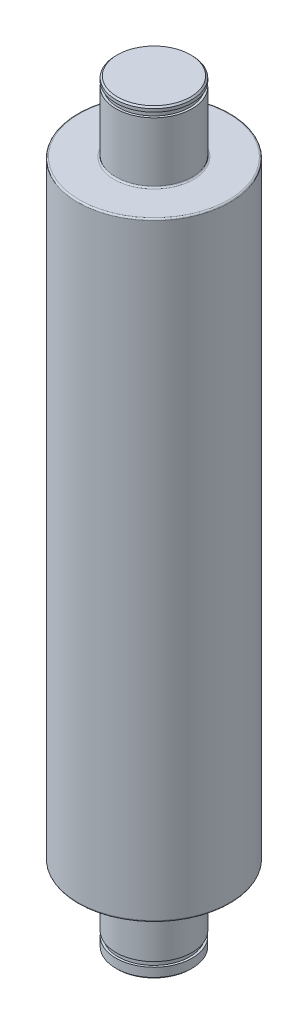
ISO-10303-21;
HEADER;
FILE_DESCRIPTION(('STEP AP214'),'2;1');
FILE_NAME('part.step','',(''),(''),'','','');
FILE_SCHEMA(('AUTOMOTIVE_DESIGN { 1 0 10303 214 1 1 1 1 }'));
ENDSEC;
DATA;
#1=APPLICATION_CONTEXT('core data for automotive mechanical design processes');
#2=APPLICATION_PROTOCOL_DEFINITION('international standard','automotive_design',2000,#1);
#3=PRODUCT_CONTEXT('',#1,'mechanical');
#4=PRODUCT('Part','Part','',(#3));
#5=PRODUCT_RELATED_PRODUCT_CATEGORY('part','',(#4));
#6=PRODUCT_DEFINITION_FORMATION('','',#4);
#7=PRODUCT_DEFINITION_CONTEXT('part definition',#1,'design');
#8=PRODUCT_DEFINITION('design','',#6,#7);
#9=PRODUCT_DEFINITION_SHAPE('','',#8);
#10=(LENGTH_UNIT() NAMED_UNIT(*) SI_UNIT(.MILLI.,.METRE.));
#11=(NAMED_UNIT(*) PLANE_ANGLE_UNIT() SI_UNIT($,.RADIAN.));
#12=(NAMED_UNIT(*) SI_UNIT($,.STERADIAN.) SOLID_ANGLE_UNIT());
#13=UNCERTAINTY_MEASURE_WITH_UNIT(LENGTH_MEASURE(1.E-05),#10,'distance_accuracy_value','');
#14=(GEOMETRIC_REPRESENTATION_CONTEXT(3) GLOBAL_UNCERTAINTY_ASSIGNED_CONTEXT((#13)) GLOBAL_UNIT_ASSIGNED_CONTEXT((#10,
#11,#12)) REPRESENTATION_CONTEXT('',''));
#15=CARTESIAN_POINT('',(0.,0.,0.));
#16=DIRECTION('',(0.,0.,1.));
#17=DIRECTION('',(1.,0.,0.));
#18=AXIS2_PLACEMENT_3D('',#15,#16,#17);
#19=CARTESIAN_POINT('',(0.,446.,0.));
#20=DIRECTION('',(0.,-1.,0.));
#21=DIRECTION('',(0.,0.,-1.));
#22=AXIS2_PLACEMENT_3D('',#19,#20,#21);
#23=CYLINDRICAL_SURFACE('',#22,25.);
#24=CARTESIAN_POINT('',(0.,401.,0.));
#25=DIRECTION('',(0.,1.,0.));
#26=DIRECTION('',(0.,0.,1.));
#27=AXIS2_PLACEMENT_3D('',#24,#25,#26);
#28=CIRCLE('',#27,25.);
#29=CARTESIAN_POINT('',(0.,401.,25.));
#30=VERTEX_POINT('',#29);
#31=EDGE_CURVE('E176',#30,#30,#28,.T.);
#32=ORIENTED_EDGE('',*,*,#31,.T.);
#33=EDGE_LOOP('',(#32));
#34=FACE_BOUND('',#33,.T.);
#35=CARTESIAN_POINT('',(0.,439.8,0.));
#36=DIRECTION('',(0.,1.,0.));
#37=DIRECTION('',(0.,0.,1.));
#38=AXIS2_PLACEMENT_3D('',#35,#36,#37);
#39=CIRCLE('',#38,25.);
#40=CARTESIAN_POINT('',(0.,439.8,25.));
#41=VERTEX_POINT('',#40);
#42=EDGE_CURVE('E141',#41,#41,#39,.T.);
#43=ORIENTED_EDGE('',*,*,#42,.F.);
#44=EDGE_LOOP('',(#43));
#45=FACE_BOUND('',#44,.T.);
#46=ADVANCED_FACE('F40',(#34,#45),#23,.T.);
#47=CARTESIAN_POINT('',(0.,0.,0.));
#48=DIRECTION('',(0.,1.,0.));
#49=DIRECTION('',(0.,0.,1.));
#50=AXIS2_PLACEMENT_3D('',#47,#48,#49);
#51=PLANE('',#50);
#52=CARTESIAN_POINT('',(0.,0.,0.));
#53=DIRECTION('',(0.,1.,0.));
#54=DIRECTION('',(0.,0.,1.));
#55=AXIS2_PLACEMENT_3D('',#52,#53,#54);
#56=CIRCLE('',#55,26.);
#57=CARTESIAN_POINT('',(0.,0.,26.));
#58=VERTEX_POINT('',#57);
#59=EDGE_CURVE('E156',#58,#58,#56,.T.);
#60=ORIENTED_EDGE('',*,*,#59,.T.);
#61=EDGE_LOOP('',(#60));
#62=FACE_BOUND('',#61,.T.);
#63=CARTESIAN_POINT('',(0.,0.,0.));
#64=DIRECTION('',(0.,1.,0.));
#65=DIRECTION('',(0.,0.,1.));
#66=AXIS2_PLACEMENT_3D('',#63,#64,#65);
#67=CIRCLE('',#66,49.);
#68=CARTESIAN_POINT('',(0.,0.,49.));
#69=VERTEX_POINT('',#68);
#70=EDGE_CURVE('E152',#69,#69,#67,.F.);
#71=ORIENTED_EDGE('',*,*,#70,.T.);
#72=EDGE_LOOP('',(#71));
#73=FACE_BOUND('',#72,.T.);
#74=ADVANCED_FACE('F225',(#62,#73),#51,.F.);
#75=CARTESIAN_POINT('',(0.,400.,0.));
#76=DIRECTION('',(0.,1.,0.));
#77=DIRECTION('',(0.,0.,1.));
#78=AXIS2_PLACEMENT_3D('',#75,#76,#77);
#79=PLANE('',#78);
#80=CARTESIAN_POINT('',(0.,400.,0.));
#81=DIRECTION('',(0.,1.,0.));
#82=DIRECTION('',(0.,0.,1.));
#83=AXIS2_PLACEMENT_3D('',#80,#81,#82);
#84=CIRCLE('',#83,49.);
#85=CARTESIAN_POINT('',(0.,400.,49.));
#86=VERTEX_POINT('',#85);
#87=EDGE_CURVE('E172',#86,#86,#84,.T.);
#88=ORIENTED_EDGE('',*,*,#87,.T.);
#89=EDGE_LOOP('',(#88));
#90=FACE_BOUND('',#89,.T.);
#91=CARTESIAN_POINT('',(0.,400.,0.));
#92=DIRECTION('',(0.,1.,0.));
#93=DIRECTION('',(0.,0.,1.));
#94=AXIS2_PLACEMENT_3D('',#91,#92,#93);
#95=CIRCLE('',#94,26.);
#96=CARTESIAN_POINT('',(0.,400.,26.));
#97=VERTEX_POINT('',#96);
#98=EDGE_CURVE('E168',#97,#97,#95,.F.);
#99=ORIENTED_EDGE('',*,*,#98,.T.);
#100=EDGE_LOOP('',(#99));
#101=FACE_BOUND('',#100,.T.);
#102=ADVANCED_FACE('F232',(#90,#101),#79,.T.);
#103=CARTESIAN_POINT('',(0.,400.,0.));
#104=DIRECTION('',(0.,-1.,0.));
#105=DIRECTION('',(0.,0.,-1.));
#106=AXIS2_PLACEMENT_3D('',#103,#104,#105);
#107=CYLINDRICAL_SURFACE('',#106,50.);
#108=CARTESIAN_POINT('',(0.,1.,0.));
#109=DIRECTION('',(0.,1.,0.));
#110=DIRECTION('',(0.,0.,1.));
#111=AXIS2_PLACEMENT_3D('',#108,#109,#110);
#112=CIRCLE('',#111,50.);
#113=CARTESIAN_POINT('',(0.,1.,50.));
#114=VERTEX_POINT('',#113);
#115=EDGE_CURVE('E164',#114,#114,#112,.T.);
#116=ORIENTED_EDGE('',*,*,#115,.T.);
#117=EDGE_LOOP('',(#116));
#118=FACE_BOUND('',#117,.T.);
#119=CARTESIAN_POINT('',(0.,399.,0.));
#120=DIRECTION('',(0.,1.,0.));
#121=DIRECTION('',(0.,0.,1.));
#122=AXIS2_PLACEMENT_3D('',#119,#120,#121);
#123=CIRCLE('',#122,50.);
#124=CARTESIAN_POINT('',(0.,399.,50.));
#125=VERTEX_POINT('',#124);
#126=EDGE_CURVE('E160',#125,#125,#123,.F.);
#127=ORIENTED_EDGE('',*,*,#126,.T.);
#128=EDGE_LOOP('',(#127));
#129=FACE_BOUND('',#128,.T.);
#130=ADVANCED_FACE('F277',(#118,#129),#107,.T.);
#131=CARTESIAN_POINT('',(0.,-50.,0.));
#132=DIRECTION('',(0.,1.,0.));
#133=DIRECTION('',(0.,0.,1.));
#134=AXIS2_PLACEMENT_3D('',#131,#132,#133);
#135=CYLINDRICAL_SURFACE('',#134,25.);
#136=CARTESIAN_POINT('',(0.,-40.,0.));
#137=DIRECTION('',(0.,1.,0.));
#138=DIRECTION('',(0.,0.,1.));
#139=AXIS2_PLACEMENT_3D('',#136,#137,#138);
#140=CIRCLE('',#139,25.);
#141=CARTESIAN_POINT('',(0.,-40.,25.));
#142=VERTEX_POINT('',#141);
#143=EDGE_CURVE('E130',#142,#142,#140,.T.);
#144=ORIENTED_EDGE('',*,*,#143,.T.);
#145=EDGE_LOOP('',(#144));
#146=FACE_BOUND('',#145,.T.);
#147=CARTESIAN_POINT('',(0.,-1.,0.));
#148=DIRECTION('',(0.,1.,0.));
#149=DIRECTION('',(0.,0.,1.));
#150=AXIS2_PLACEMENT_3D('',#147,#148,#149);
#151=CIRCLE('',#150,25.);
#152=CARTESIAN_POINT('',(0.,-1.,25.));
#153=VERTEX_POINT('',#152);
#154=EDGE_CURVE('E145',#153,#153,#151,.F.);
#155=ORIENTED_EDGE('',*,*,#154,.T.);
#156=EDGE_LOOP('',(#155));
#157=FACE_BOUND('',#156,.T.);
#158=ADVANCED_FACE('F274',(#146,#157),#135,.T.);
#159=CARTESIAN_POINT('',(0.,-1.,0.));
#160=DIRECTION('',(0.,1.,0.));
#161=DIRECTION('',(0.,0.,1.));
#162=AXIS2_PLACEMENT_3D('',#159,#160,#161);
#163=TOROIDAL_SURFACE('',#162,26.,1.);
#164=ORIENTED_EDGE('',*,*,#59,.F.);
#165=EDGE_LOOP('',(#164));
#166=FACE_BOUND('',#165,.T.);
#167=ORIENTED_EDGE('',*,*,#154,.F.);
#168=EDGE_LOOP('',(#167));
#169=FACE_BOUND('',#168,.T.);
#170=ADVANCED_FACE('F276',(#166,#169),#163,.F.);
#171=CARTESIAN_POINT('',(0.,1.,0.));
#172=DIRECTION('',(0.,1.,0.));
#173=DIRECTION('',(0.,0.,1.));
#174=AXIS2_PLACEMENT_3D('',#171,#172,#173);
#175=TOROIDAL_SURFACE('',#174,49.,1.);
#176=ORIENTED_EDGE('',*,*,#70,.F.);
#177=EDGE_LOOP('',(#176));
#178=FACE_BOUND('',#177,.T.);
#179=ORIENTED_EDGE('',*,*,#115,.F.);
#180=EDGE_LOOP('',(#179));
#181=FACE_BOUND('',#180,.T.);
#182=ADVANCED_FACE('F283',(#178,#181),#175,.T.);
#183=CARTESIAN_POINT('',(0.,399.,0.));
#184=DIRECTION('',(0.,1.,0.));
#185=DIRECTION('',(0.,0.,1.));
#186=AXIS2_PLACEMENT_3D('',#183,#184,#185);
#187=TOROIDAL_SURFACE('',#186,49.,1.);
#188=ORIENTED_EDGE('',*,*,#126,.F.);
#189=EDGE_LOOP('',(#188));
#190=FACE_BOUND('',#189,.T.);
#191=ORIENTED_EDGE('',*,*,#87,.F.);
#192=EDGE_LOOP('',(#191));
#193=FACE_BOUND('',#192,.T.);
#194=ADVANCED_FACE('F309',(#190,#193),#187,.T.);
#195=CARTESIAN_POINT('',(0.,401.,0.));
#196=DIRECTION('',(0.,1.,0.));
#197=DIRECTION('',(0.,0.,1.));
#198=AXIS2_PLACEMENT_3D('',#195,#196,#197);
#199=TOROIDAL_SURFACE('',#198,26.,1.);
#200=ORIENTED_EDGE('',*,*,#98,.F.);
#201=EDGE_LOOP('',(#200));
#202=FACE_BOUND('',#201,.T.);
#203=ORIENTED_EDGE('',*,*,#31,.F.);
#204=EDGE_LOOP('',(#203));
#205=FACE_BOUND('',#204,.T.);
#206=ADVANCED_FACE('F266',(#202,#205),#199,.F.);
#207=CARTESIAN_POINT('',(0.,439.8,0.));
#208=DIRECTION('',(0.,1.,0.));
#209=DIRECTION('',(0.,0.,1.));
#210=AXIS2_PLACEMENT_3D('',#207,#208,#209);
#211=PLANE('',#210);
#212=CARTESIAN_POINT('',(0.,439.8,0.));
#213=DIRECTION('',(0.,1.,0.));
#214=DIRECTION('',(0.,0.,1.));
#215=AXIS2_PLACEMENT_3D('',#212,#213,#214);
#216=CIRCLE('',#215,23.5);
#217=CARTESIAN_POINT('',(0.,439.8,23.5));
#218=VERTEX_POINT('',#217);
#219=EDGE_CURVE('E131',#218,#218,#216,.T.);
#220=ORIENTED_EDGE('',*,*,#219,.F.);
#221=EDGE_LOOP('',(#220));
#222=FACE_BOUND('',#221,.T.);
#223=ORIENTED_EDGE('',*,*,#42,.T.);
#224=EDGE_LOOP('',(#223));
#225=FACE_BOUND('',#224,.T.);
#226=ADVANCED_FACE('F257',(#222,#225),#211,.T.);
#227=CARTESIAN_POINT('',(0.,443.,0.));
#228=DIRECTION('',(0.,1.,0.));
#229=DIRECTION('',(0.,0.,1.));
#230=AXIS2_PLACEMENT_3D('',#227,#228,#229);
#231=PLANE('',#230);
#232=CARTESIAN_POINT('',(0.,443.,0.));
#233=DIRECTION('',(0.,1.,0.));
#234=DIRECTION('',(0.,0.,1.));
#235=AXIS2_PLACEMENT_3D('',#232,#233,#234);
#236=CIRCLE('',#235,23.5);
#237=CARTESIAN_POINT('',(0.,443.,23.5));
#238=VERTEX_POINT('',#237);
#239=EDGE_CURVE('E136',#238,#238,#236,.T.);
#240=ORIENTED_EDGE('',*,*,#239,.T.);
#241=EDGE_LOOP('',(#240));
#242=FACE_BOUND('',#241,.T.);
#243=CARTESIAN_POINT('',(0.,443.,0.));
#244=DIRECTION('',(0.,1.,0.));
#245=DIRECTION('',(0.,0.,1.));
#246=AXIS2_PLACEMENT_3D('',#243,#244,#245);
#247=CIRCLE('',#246,25.);
#248=CARTESIAN_POINT('',(0.,443.,25.));
#249=VERTEX_POINT('',#248);
#250=EDGE_CURVE('E135',#249,#249,#247,.T.);
#251=ORIENTED_EDGE('',*,*,#250,.F.);
#252=EDGE_LOOP('',(#251));
#253=FACE_BOUND('',#252,.T.);
#254=ADVANCED_FACE('F255',(#242,#253),#231,.F.);
#255=CARTESIAN_POINT('',(0.,439.8,0.));
#256=DIRECTION('',(0.,1.,0.));
#257=DIRECTION('',(0.,0.,1.));
#258=AXIS2_PLACEMENT_3D('',#255,#256,#257);
#259=CYLINDRICAL_SURFACE('',#258,23.5);
#260=ORIENTED_EDGE('',*,*,#219,.T.);
#261=EDGE_LOOP('',(#260));
#262=FACE_BOUND('',#261,.T.);
#263=ORIENTED_EDGE('',*,*,#239,.F.);
#264=EDGE_LOOP('',(#263));
#265=FACE_BOUND('',#264,.T.);
#266=ADVANCED_FACE('F249',(#262,#265),#259,.T.);
#267=CARTESIAN_POINT('',(0.,446.,0.));
#268=DIRECTION('',(0.,1.,0.));
#269=DIRECTION('',(0.,0.,1.));
#270=AXIS2_PLACEMENT_3D('',#267,#268,#269);
#271=PLANE('',#270);
#272=CARTESIAN_POINT('',(0.,446.,0.));
#273=DIRECTION('',(0.,1.,0.));
#274=DIRECTION('',(0.,0.,1.));
#275=AXIS2_PLACEMENT_3D('',#272,#273,#274);
#276=CIRCLE('',#275,23.9999999999999);
#277=CARTESIAN_POINT('',(0.,446.,23.9999999999999));
#278=VERTEX_POINT('',#277);
#279=EDGE_CURVE('E194',#278,#278,#276,.T.);
#280=ORIENTED_EDGE('',*,*,#279,.T.);
#281=EDGE_LOOP('',(#280));
#282=FACE_BOUND('',#281,.T.);
#283=ADVANCED_FACE('F240',(#282),#271,.T.);
#284=CARTESIAN_POINT('',(0.,445.,0.));
#285=DIRECTION('',(0.,1.,0.));
#286=DIRECTION('',(0.,0.,1.));
#287=AXIS2_PLACEMENT_3D('',#284,#285,#286);
#288=CIRCLE('',#287,25.);
#289=CARTESIAN_POINT('',(0.,445.,25.));
#290=VERTEX_POINT('',#289);
#291=EDGE_CURVE('E198',#290,#290,#288,.F.);
#292=ORIENTED_EDGE('',*,*,#291,.T.);
#293=EDGE_LOOP('',(#292));
#294=FACE_BOUND('',#293,.T.);
#295=ORIENTED_EDGE('',*,*,#250,.T.);
#296=EDGE_LOOP('',(#295));
#297=FACE_BOUND('',#296,.T.);
#298=ADVANCED_FACE('F228',(#294,#297),#23,.T.);
#299=CARTESIAN_POINT('',(28.7495233925461,-43.2,0.));
#300=DIRECTION('',(0.,-1.,0.));
#301=DIRECTION('',(0.,0.,-1.));
#302=AXIS2_PLACEMENT_3D('',#299,#300,#301);
#303=PLANE('',#302);
#304=CARTESIAN_POINT('',(0.,-43.2,0.));
#305=DIRECTION('',(0.,-1.,0.));
#306=DIRECTION('',(0.,0.,-1.));
#307=AXIS2_PLACEMENT_3D('',#304,#305,#306);
#308=CIRCLE('',#307,23.5);
#309=CARTESIAN_POINT('',(0.,-43.2,-23.5));
#310=VERTEX_POINT('',#309);
#311=EDGE_CURVE('E126',#310,#310,#308,.T.);
#312=ORIENTED_EDGE('',*,*,#311,.T.);
#313=EDGE_LOOP('',(#312));
#314=FACE_BOUND('',#313,.T.);
#315=CARTESIAN_POINT('',(0.,-43.2,0.));
#316=DIRECTION('',(0.,-1.,0.));
#317=DIRECTION('',(0.,0.,-1.));
#318=AXIS2_PLACEMENT_3D('',#315,#316,#317);
#319=CIRCLE('',#318,25.);
#320=CARTESIAN_POINT('',(0.,-43.2,-25.));
#321=VERTEX_POINT('',#320);
#322=EDGE_CURVE('E140',#321,#321,#319,.T.);
#323=ORIENTED_EDGE('',*,*,#322,.F.);
#324=EDGE_LOOP('',(#323));
#325=FACE_BOUND('',#324,.T.);
#326=ADVANCED_FACE('F239',(#314,#325),#303,.F.);
#327=CARTESIAN_POINT('',(28.7495233925461,-40.,0.));
#328=DIRECTION('',(0.,1.,0.));
#329=DIRECTION('',(0.,0.,1.));
#330=AXIS2_PLACEMENT_3D('',#327,#328,#329);
#331=PLANE('',#330);
#332=CARTESIAN_POINT('',(0.,-40.,0.));
#333=DIRECTION('',(0.,-1.,0.));
#334=DIRECTION('',(0.,0.,-1.));
#335=AXIS2_PLACEMENT_3D('',#332,#333,#334);
#336=CIRCLE('',#335,23.5);
#337=CARTESIAN_POINT('',(0.,-40.,-23.5));
#338=VERTEX_POINT('',#337);
#339=EDGE_CURVE('E119',#338,#338,#336,.T.);
#340=ORIENTED_EDGE('',*,*,#339,.F.);
#341=EDGE_LOOP('',(#340));
#342=FACE_BOUND('',#341,.T.);
#343=ORIENTED_EDGE('',*,*,#143,.F.);
#344=EDGE_LOOP('',(#343));
#345=FACE_BOUND('',#344,.T.);
#346=ADVANCED_FACE('F246',(#342,#345),#331,.F.);
#347=CARTESIAN_POINT('',(0.,-50.,0.));
#348=DIRECTION('',(0.,-1.,0.));
#349=DIRECTION('',(0.,0.,-1.));
#350=AXIS2_PLACEMENT_3D('',#347,#348,#349);
#351=CYLINDRICAL_SURFACE('',#350,23.5);
#352=ORIENTED_EDGE('',*,*,#311,.F.);
#353=EDGE_LOOP('',(#352));
#354=FACE_BOUND('',#353,.T.);
#355=ORIENTED_EDGE('',*,*,#339,.T.);
#356=EDGE_LOOP('',(#355));
#357=FACE_BOUND('',#356,.T.);
#358=ADVANCED_FACE('F273',(#354,#357),#351,.T.);
#359=CARTESIAN_POINT('',(0.,-50.,0.));
#360=DIRECTION('',(0.,-1.,0.));
#361=DIRECTION('',(0.,0.,-1.));
#362=AXIS2_PLACEMENT_3D('',#359,#360,#361);
#363=PLANE('',#362);
#364=DIRECTION('',(0.,0.,-1.));
#365=VECTOR('',#364,1.);
#366=CARTESIAN_POINT('',(-3.,-50.,15.));
#367=LINE('',#366,#365);
#368=CARTESIAN_POINT('',(-3.,-50.,15.));
#369=VERTEX_POINT('',#368);
#370=CARTESIAN_POINT('',(-3.,-50.,12.6491106406735));
#371=VERTEX_POINT('',#370);
#372=EDGE_CURVE('E104',#369,#371,#367,.T.);
#373=ORIENTED_EDGE('',*,*,#372,.F.);
#374=DIRECTION('',(-1.,0.,0.));
#375=VECTOR('',#374,1.);
#376=CARTESIAN_POINT('',(-3.,-50.,15.));
#377=LINE('',#376,#375);
#378=CARTESIAN_POINT('',(3.,-50.,15.));
#379=VERTEX_POINT('',#378);
#380=EDGE_CURVE('E109',#379,#369,#377,.T.);
#381=ORIENTED_EDGE('',*,*,#380,.F.);
#382=DIRECTION('',(0.,0.,1.));
#383=VECTOR('',#382,1.);
#384=CARTESIAN_POINT('',(3.,-50.,15.));
#385=LINE('',#384,#383);
#386=CARTESIAN_POINT('',(3.,-50.,12.6491106406735));
#387=VERTEX_POINT('',#386);
#388=EDGE_CURVE('E92',#387,#379,#385,.T.);
#389=ORIENTED_EDGE('',*,*,#388,.F.);
#390=CARTESIAN_POINT('',(0.,-50.,0.));
#391=DIRECTION('',(0.,-1.,0.));
#392=DIRECTION('',(0.,0.,-1.));
#393=AXIS2_PLACEMENT_3D('',#390,#391,#392);
#394=CIRCLE('',#393,13.);
#395=EDGE_CURVE('E113',#371,#387,#394,.T.);
#396=ORIENTED_EDGE('',*,*,#395,.F.);
#397=EDGE_LOOP('',(#373,#381,#389,#396));
#398=FACE_BOUND('',#397,.T.);
#399=CARTESIAN_POINT('',(0.,-50.,0.));
#400=DIRECTION('',(0.,-1.,0.));
#401=DIRECTION('',(0.,0.,-1.));
#402=AXIS2_PLACEMENT_3D('',#399,#400,#401);
#403=CIRCLE('',#402,23.9999999999999);
#404=CARTESIAN_POINT('',(0.,-50.,-23.9999999999999));
#405=VERTEX_POINT('',#404);
#406=EDGE_CURVE('E180',#405,#405,#403,.T.);
#407=ORIENTED_EDGE('',*,*,#406,.T.);
#408=EDGE_LOOP('',(#407));
#409=FACE_BOUND('',#408,.T.);
#410=ADVANCED_FACE('F209',(#398,#409),#363,.T.);
#411=CARTESIAN_POINT('',(0.,-49.,0.));
#412=DIRECTION('',(0.,-1.,0.));
#413=DIRECTION('',(0.,0.,-1.));
#414=AXIS2_PLACEMENT_3D('',#411,#412,#413);
#415=CIRCLE('',#414,25.);
#416=CARTESIAN_POINT('',(0.,-49.,-25.));
#417=VERTEX_POINT('',#416);
#418=EDGE_CURVE('E190',#417,#417,#415,.F.);
#419=ORIENTED_EDGE('',*,*,#418,.T.);
#420=EDGE_LOOP('',(#419));
#421=FACE_BOUND('',#420,.T.);
#422=ORIENTED_EDGE('',*,*,#322,.T.);
#423=EDGE_LOOP('',(#422));
#424=FACE_BOUND('',#423,.T.);
#425=ADVANCED_FACE('F272',(#421,#424),#135,.T.);
#426=CARTESIAN_POINT('',(0.,-50.,0.));
#427=DIRECTION('',(0.,1.,0.));
#428=DIRECTION('',(0.,0.,1.));
#429=AXIS2_PLACEMENT_3D('',#426,#427,#428);
#430=CONICAL_SURFACE('',#429,23.9999999999999,0.785398163397486);
#431=ORIENTED_EDGE('',*,*,#418,.F.);
#432=EDGE_LOOP('',(#431));
#433=FACE_BOUND('',#432,.T.);
#434=ORIENTED_EDGE('',*,*,#406,.F.);
#435=EDGE_LOOP('',(#434));
#436=FACE_BOUND('',#435,.T.);
#437=ADVANCED_FACE('F290',(#433,#436),#430,.T.);
#438=CARTESIAN_POINT('',(0.,446.,0.));
#439=DIRECTION('',(0.,-1.,0.));
#440=DIRECTION('',(0.,0.,-1.));
#441=AXIS2_PLACEMENT_3D('',#438,#439,#440);
#442=CONICAL_SURFACE('',#441,23.9999999999999,0.785398163397493);
#443=ORIENTED_EDGE('',*,*,#291,.F.);
#444=EDGE_LOOP('',(#443));
#445=FACE_BOUND('',#444,.T.);
#446=ORIENTED_EDGE('',*,*,#279,.F.);
#447=EDGE_LOOP('',(#446));
#448=FACE_BOUND('',#447,.T.);
#449=ADVANCED_FACE('F42',(#445,#448),#442,.T.);
#450=CARTESIAN_POINT('',(0.,-9.99999999999999,0.));
#451=DIRECTION('',(0.,-1.,0.));
#452=DIRECTION('',(0.,0.,-1.));
#453=AXIS2_PLACEMENT_3D('',#450,#451,#452);
#454=CYLINDRICAL_SURFACE('',#453,13.);
#455=CARTESIAN_POINT('',(0.,-9.99999999999999,0.));
#456=DIRECTION('',(0.,-1.,0.));
#457=DIRECTION('',(0.,0.,-1.));
#458=AXIS2_PLACEMENT_3D('',#455,#456,#457);
#459=CIRCLE('',#458,13.);
#460=CARTESIAN_POINT('',(0.,-9.99999999999999,-13.));
#461=VERTEX_POINT('',#460);
#462=EDGE_CURVE('E115',#461,#461,#459,.T.);
#463=ORIENTED_EDGE('',*,*,#462,.F.);
#464=EDGE_LOOP('',(#463));
#465=FACE_BOUND('',#464,.T.);
#466=CARTESIAN_POINT('',(0.,-12.,0.));
#467=DIRECTION('',(0.,-1.,0.));
#468=DIRECTION('',(0.,0.,-1.));
#469=AXIS2_PLACEMENT_3D('',#466,#467,#468);
#470=CIRCLE('',#469,13.);
#471=CARTESIAN_POINT('',(-3.,-12.,12.6491106406735));
#472=VERTEX_POINT('',#471);
#473=CARTESIAN_POINT('',(3.,-12.,12.6491106406735));
#474=VERTEX_POINT('',#473);
#475=EDGE_CURVE('E61',#472,#474,#470,.F.);
#476=ORIENTED_EDGE('',*,*,#475,.F.);
#477=DIRECTION('',(0.,-1.,0.));
#478=VECTOR('',#477,1.);
#479=CARTESIAN_POINT('',(-3.,-9.99999999999999,12.6491106406735));
#480=LINE('',#479,#478);
#481=EDGE_CURVE('E11',#472,#371,#480,.T.);
#482=ORIENTED_EDGE('',*,*,#481,.T.);
#483=ORIENTED_EDGE('',*,*,#395,.T.);
#484=DIRECTION('',(0.,-1.,0.));
#485=VECTOR('',#484,1.);
#486=CARTESIAN_POINT('',(3.,-9.99999999999999,12.6491106406735));
#487=LINE('',#486,#485);
#488=EDGE_CURVE('E49',#387,#474,#487,.F.);
#489=ORIENTED_EDGE('',*,*,#488,.T.);
#490=EDGE_LOOP('',(#476,#482,#483,#489));
#491=FACE_BOUND('',#490,.T.);
#492=ADVANCED_FACE('F205',(#465,#491),#454,.F.);
#493=CARTESIAN_POINT('',(0.,-9.99999999999999,0.));
#494=DIRECTION('',(0.,-1.,0.));
#495=DIRECTION('',(0.,0.,-1.));
#496=AXIS2_PLACEMENT_3D('',#493,#494,#495);
#497=PLANE('',#496);
#498=ORIENTED_EDGE('',*,*,#462,.T.);
#499=EDGE_LOOP('',(#498));
#500=FACE_BOUND('',#499,.T.);
#501=ADVANCED_FACE('F215',(#500),#497,.T.);
#502=CARTESIAN_POINT('',(-3.,-12.,15.));
#503=DIRECTION('',(-1.,0.,0.));
#504=DIRECTION('',(0.,0.,1.));
#505=AXIS2_PLACEMENT_3D('',#502,#503,#504);
#506=PLANE('',#505);
#507=DIRECTION('',(0.,0.,-1.));
#508=VECTOR('',#507,1.);
#509=CARTESIAN_POINT('',(-3.,-12.,15.));
#510=LINE('',#509,#508);
#511=CARTESIAN_POINT('',(-3.,-12.,15.));
#512=VERTEX_POINT('',#511);
#513=EDGE_CURVE('E56',#512,#472,#510,.T.);
#514=ORIENTED_EDGE('',*,*,#513,.F.);
#515=DIRECTION('',(0.,-1.,0.));
#516=VECTOR('',#515,1.);
#517=CARTESIAN_POINT('',(-3.,-12.,15.));
#518=LINE('',#517,#516);
#519=EDGE_CURVE('E97',#512,#369,#518,.T.);
#520=ORIENTED_EDGE('',*,*,#519,.T.);
#521=ORIENTED_EDGE('',*,*,#372,.T.);
#522=ORIENTED_EDGE('',*,*,#481,.F.);
#523=EDGE_LOOP('',(#514,#520,#521,#522));
#524=FACE_BOUND('',#523,.T.);
#525=ADVANCED_FACE('F212',(#524),#506,.F.);
#526=CARTESIAN_POINT('',(3.,-12.,15.));
#527=DIRECTION('',(1.,0.,0.));
#528=DIRECTION('',(0.,0.,-1.));
#529=AXIS2_PLACEMENT_3D('',#526,#527,#528);
#530=PLANE('',#529);
#531=ORIENTED_EDGE('',*,*,#388,.T.);
#532=DIRECTION('',(0.,-1.,0.));
#533=VECTOR('',#532,1.);
#534=CARTESIAN_POINT('',(3.,-12.,15.));
#535=LINE('',#534,#533);
#536=CARTESIAN_POINT('',(3.,-12.,15.));
#537=VERTEX_POINT('',#536);
#538=EDGE_CURVE('E89',#537,#379,#535,.T.);
#539=ORIENTED_EDGE('',*,*,#538,.F.);
#540=DIRECTION('',(0.,0.,1.));
#541=VECTOR('',#540,1.);
#542=CARTESIAN_POINT('',(3.,-12.,15.));
#543=LINE('',#542,#541);
#544=EDGE_CURVE('E79',#474,#537,#543,.T.);
#545=ORIENTED_EDGE('',*,*,#544,.F.);
#546=ORIENTED_EDGE('',*,*,#488,.F.);
#547=EDGE_LOOP('',(#531,#539,#545,#546));
#548=FACE_BOUND('',#547,.T.);
#549=ADVANCED_FACE('F90',(#548),#530,.F.);
#550=CARTESIAN_POINT('',(0.,-12.,0.));
#551=DIRECTION('',(0.,-1.,0.));
#552=DIRECTION('',(0.,0.,-1.));
#553=AXIS2_PLACEMENT_3D('',#550,#551,#552);
#554=PLANE('',#553);
#555=ORIENTED_EDGE('',*,*,#475,.T.);
#556=ORIENTED_EDGE('',*,*,#544,.T.);
#557=DIRECTION('',(-1.,0.,0.));
#558=VECTOR('',#557,1.);
#559=CARTESIAN_POINT('',(-3.,-12.,15.));
#560=LINE('',#559,#558);
#561=EDGE_CURVE('E83',#537,#512,#560,.T.);
#562=ORIENTED_EDGE('',*,*,#561,.T.);
#563=ORIENTED_EDGE('',*,*,#513,.T.);
#564=EDGE_LOOP('',(#555,#556,#562,#563));
#565=FACE_BOUND('',#564,.T.);
#566=ADVANCED_FACE('F81',(#565),#554,.T.);
#567=CARTESIAN_POINT('',(-3.,-12.,15.));
#568=DIRECTION('',(0.,0.,1.));
#569=DIRECTION('',(1.,0.,0.));
#570=AXIS2_PLACEMENT_3D('',#567,#568,#569);
#571=PLANE('',#570);
#572=ORIENTED_EDGE('',*,*,#380,.T.);
#573=ORIENTED_EDGE('',*,*,#519,.F.);
#574=ORIENTED_EDGE('',*,*,#561,.F.);
#575=ORIENTED_EDGE('',*,*,#538,.T.);
#576=EDGE_LOOP('',(#572,#573,#574,#575));
#577=FACE_BOUND('',#576,.T.);
#578=ADVANCED_FACE('F99',(#577),#571,.F.);
#579=CLOSED_SHELL('',(#46,#74,#102,#130,#158,#170,#182,#194,#206,#226,#254,#266,#283,#298,#326,
#346,#358,#410,#425,#437,#449,#492,#501,#525,#549,#566,#578));
#580=MANIFOLD_SOLID_BREP('B2',#579);
#581=ADVANCED_BREP_SHAPE_REPRESENTATION('',(#18,#580),#14);
#582=SHAPE_DEFINITION_REPRESENTATION(#9,#581);
ENDSEC;
END-ISO-10303-21;
